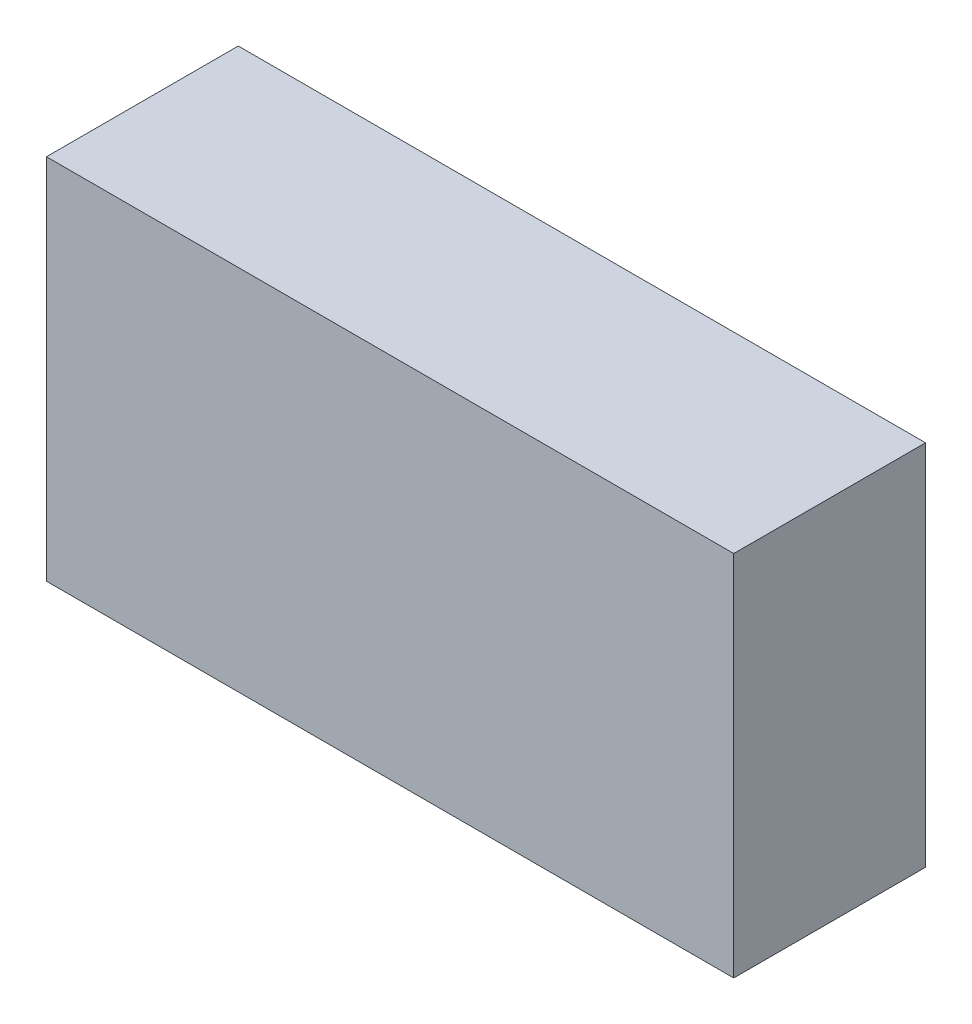
ISO-10303-21;
HEADER;
FILE_DESCRIPTION(('STEP AP214'),'2;1');
FILE_NAME('part.step','',(''),(''),'','','');
FILE_SCHEMA(('AUTOMOTIVE_DESIGN { 1 0 10303 214 1 1 1 1 }'));
ENDSEC;
DATA;
#1=APPLICATION_CONTEXT('core data for automotive mechanical design processes');
#2=APPLICATION_PROTOCOL_DEFINITION('international standard','automotive_design',2000,#1);
#3=PRODUCT_CONTEXT('',#1,'mechanical');
#4=PRODUCT('Part','Part','',(#3));
#5=PRODUCT_RELATED_PRODUCT_CATEGORY('part','',(#4));
#6=PRODUCT_DEFINITION_FORMATION('','',#4);
#7=PRODUCT_DEFINITION_CONTEXT('part definition',#1,'design');
#8=PRODUCT_DEFINITION('design','',#6,#7);
#9=PRODUCT_DEFINITION_SHAPE('','',#8);
#10=(LENGTH_UNIT() NAMED_UNIT(*) SI_UNIT(.MILLI.,.METRE.));
#11=(NAMED_UNIT(*) PLANE_ANGLE_UNIT() SI_UNIT($,.RADIAN.));
#12=(NAMED_UNIT(*) SI_UNIT($,.STERADIAN.) SOLID_ANGLE_UNIT());
#13=UNCERTAINTY_MEASURE_WITH_UNIT(LENGTH_MEASURE(1.E-05),#10,'distance_accuracy_value','');
#14=(GEOMETRIC_REPRESENTATION_CONTEXT(3) GLOBAL_UNCERTAINTY_ASSIGNED_CONTEXT((#13)) GLOBAL_UNIT_ASSIGNED_CONTEXT((#10,
#11,#12)) REPRESENTATION_CONTEXT('',''));
#15=CARTESIAN_POINT('',(0.,0.,0.));
#16=DIRECTION('',(0.,0.,1.));
#17=DIRECTION('',(1.,0.,0.));
#18=AXIS2_PLACEMENT_3D('',#15,#16,#17);
#19=CARTESIAN_POINT('',(0.,0.,15.24));
#20=DIRECTION('',(1.,0.,0.));
#21=DIRECTION('',(0.,0.,-1.));
#22=AXIS2_PLACEMENT_3D('',#19,#20,#21);
#23=PLANE('',#22);
#24=DIRECTION('',(0.,-1.,0.));
#25=VECTOR('',#24,1.);
#26=CARTESIAN_POINT('',(0.,0.,0.));
#27=LINE('',#26,#25);
#28=CARTESIAN_POINT('',(0.,29.21,0.));
#29=VERTEX_POINT('',#28);
#30=CARTESIAN_POINT('',(0.,0.,0.));
#31=VERTEX_POINT('',#30);
#32=EDGE_CURVE('E100',#29,#31,#27,.T.);
#33=ORIENTED_EDGE('',*,*,#32,.T.);
#34=DIRECTION('',(0.,0.,-1.));
#35=VECTOR('',#34,1.);
#36=CARTESIAN_POINT('',(0.,0.,15.24));
#37=LINE('',#36,#35);
#38=CARTESIAN_POINT('',(0.,0.,15.24));
#39=VERTEX_POINT('',#38);
#40=EDGE_CURVE('E11',#39,#31,#37,.T.);
#41=ORIENTED_EDGE('',*,*,#40,.F.);
#42=DIRECTION('',(0.,-1.,0.));
#43=VECTOR('',#42,1.);
#44=CARTESIAN_POINT('',(0.,0.,15.24));
#45=LINE('',#44,#43);
#46=CARTESIAN_POINT('',(0.,29.21,15.24));
#47=VERTEX_POINT('',#46);
#48=EDGE_CURVE('E88',#47,#39,#45,.T.);
#49=ORIENTED_EDGE('',*,*,#48,.F.);
#50=DIRECTION('',(0.,0.,-1.));
#51=VECTOR('',#50,1.);
#52=CARTESIAN_POINT('',(0.,29.21,15.24));
#53=LINE('',#52,#51);
#54=EDGE_CURVE('E96',#47,#29,#53,.T.);
#55=ORIENTED_EDGE('',*,*,#54,.T.);
#56=EDGE_LOOP('',(#33,#41,#49,#55));
#57=FACE_BOUND('',#56,.T.);
#58=ADVANCED_FACE('F37',(#57),#23,.F.);
#59=CARTESIAN_POINT('',(0.,0.,15.24));
#60=DIRECTION('',(0.,1.,0.));
#61=DIRECTION('',(0.,0.,1.));
#62=AXIS2_PLACEMENT_3D('',#59,#60,#61);
#63=PLANE('',#62);
#64=DIRECTION('',(1.,0.,0.));
#65=VECTOR('',#64,1.);
#66=CARTESIAN_POINT('',(0.,0.,0.));
#67=LINE('',#66,#65);
#68=CARTESIAN_POINT('',(54.61,0.,0.));
#69=VERTEX_POINT('',#68);
#70=EDGE_CURVE('E92',#31,#69,#67,.T.);
#71=ORIENTED_EDGE('',*,*,#70,.T.);
#72=DIRECTION('',(0.,0.,-1.));
#73=VECTOR('',#72,1.);
#74=CARTESIAN_POINT('',(54.61,0.,15.24));
#75=LINE('',#74,#73);
#76=CARTESIAN_POINT('',(54.61,0.,15.24));
#77=VERTEX_POINT('',#76);
#78=EDGE_CURVE('E45',#77,#69,#75,.T.);
#79=ORIENTED_EDGE('',*,*,#78,.F.);
#80=DIRECTION('',(1.,0.,0.));
#81=VECTOR('',#80,1.);
#82=CARTESIAN_POINT('',(0.,0.,15.24));
#83=LINE('',#82,#81);
#84=EDGE_CURVE('E83',#39,#77,#83,.T.);
#85=ORIENTED_EDGE('',*,*,#84,.F.);
#86=ORIENTED_EDGE('',*,*,#40,.T.);
#87=EDGE_LOOP('',(#71,#79,#85,#86));
#88=FACE_BOUND('',#87,.T.);
#89=ADVANCED_FACE('F91',(#88),#63,.F.);
#90=CARTESIAN_POINT('',(54.61,0.,15.24));
#91=DIRECTION('',(-1.,0.,0.));
#92=DIRECTION('',(0.,-1.,0.));
#93=AXIS2_PLACEMENT_3D('',#90,#91,#92);
#94=PLANE('',#93);
#95=DIRECTION('',(0.,1.,0.));
#96=VECTOR('',#95,1.);
#97=CARTESIAN_POINT('',(54.61,0.,0.));
#98=LINE('',#97,#96);
#99=CARTESIAN_POINT('',(54.61,29.21,0.));
#100=VERTEX_POINT('',#99);
#101=EDGE_CURVE('E70',#69,#100,#98,.T.);
#102=ORIENTED_EDGE('',*,*,#101,.T.);
#103=DIRECTION('',(0.,0.,-1.));
#104=VECTOR('',#103,1.);
#105=CARTESIAN_POINT('',(54.61,29.21,15.24));
#106=LINE('',#105,#104);
#107=CARTESIAN_POINT('',(54.61,29.21,15.24));
#108=VERTEX_POINT('',#107);
#109=EDGE_CURVE('E93',#108,#100,#106,.T.);
#110=ORIENTED_EDGE('',*,*,#109,.F.);
#111=DIRECTION('',(0.,1.,0.));
#112=VECTOR('',#111,1.);
#113=CARTESIAN_POINT('',(54.61,0.,15.24));
#114=LINE('',#113,#112);
#115=EDGE_CURVE('E86',#77,#108,#114,.T.);
#116=ORIENTED_EDGE('',*,*,#115,.F.);
#117=ORIENTED_EDGE('',*,*,#78,.T.);
#118=EDGE_LOOP('',(#102,#110,#116,#117));
#119=FACE_BOUND('',#118,.T.);
#120=ADVANCED_FACE('F94',(#119),#94,.F.);
#121=CARTESIAN_POINT('',(0.,29.21,15.24));
#122=DIRECTION('',(0.,-1.,0.));
#123=DIRECTION('',(0.,0.,-1.));
#124=AXIS2_PLACEMENT_3D('',#121,#122,#123);
#125=PLANE('',#124);
#126=DIRECTION('',(-1.,0.,0.));
#127=VECTOR('',#126,1.);
#128=CARTESIAN_POINT('',(0.,29.21,0.));
#129=LINE('',#128,#127);
#130=EDGE_CURVE('E76',#100,#29,#129,.T.);
#131=ORIENTED_EDGE('',*,*,#130,.T.);
#132=ORIENTED_EDGE('',*,*,#54,.F.);
#133=DIRECTION('',(-1.,0.,0.));
#134=VECTOR('',#133,1.);
#135=CARTESIAN_POINT('',(0.,29.21,15.24));
#136=LINE('',#135,#134);
#137=EDGE_CURVE('E53',#108,#47,#136,.T.);
#138=ORIENTED_EDGE('',*,*,#137,.F.);
#139=ORIENTED_EDGE('',*,*,#109,.T.);
#140=EDGE_LOOP('',(#131,#132,#138,#139));
#141=FACE_BOUND('',#140,.T.);
#142=ADVANCED_FACE('F107',(#141),#125,.F.);
#143=CARTESIAN_POINT('',(0.,0.,15.24));
#144=DIRECTION('',(0.,0.,-1.));
#145=DIRECTION('',(-1.,0.,0.));
#146=AXIS2_PLACEMENT_3D('',#143,#144,#145);
#147=PLANE('',#146);
#148=ORIENTED_EDGE('',*,*,#48,.T.);
#149=ORIENTED_EDGE('',*,*,#84,.T.);
#150=ORIENTED_EDGE('',*,*,#115,.T.);
#151=ORIENTED_EDGE('',*,*,#137,.T.);
#152=EDGE_LOOP('',(#148,#149,#150,#151));
#153=FACE_BOUND('',#152,.T.);
#154=ADVANCED_FACE('F84',(#153),#147,.F.);
#155=CARTESIAN_POINT('',(0.,0.,0.));
#156=DIRECTION('',(0.,0.,-1.));
#157=DIRECTION('',(-1.,0.,0.));
#158=AXIS2_PLACEMENT_3D('',#155,#156,#157);
#159=PLANE('',#158);
#160=ORIENTED_EDGE('',*,*,#32,.F.);
#161=ORIENTED_EDGE('',*,*,#130,.F.);
#162=ORIENTED_EDGE('',*,*,#101,.F.);
#163=ORIENTED_EDGE('',*,*,#70,.F.);
#164=EDGE_LOOP('',(#160,#161,#162,#163));
#165=FACE_BOUND('',#164,.T.);
#166=ADVANCED_FACE('F110',(#165),#159,.T.);
#167=CLOSED_SHELL('',(#58,#89,#120,#142,#154,#166));
#168=MANIFOLD_SOLID_BREP('B2',#167);
#169=ADVANCED_BREP_SHAPE_REPRESENTATION('',(#18,#168),#14);
#170=SHAPE_DEFINITION_REPRESENTATION(#9,#169);
ENDSEC;
END-ISO-10303-21;
